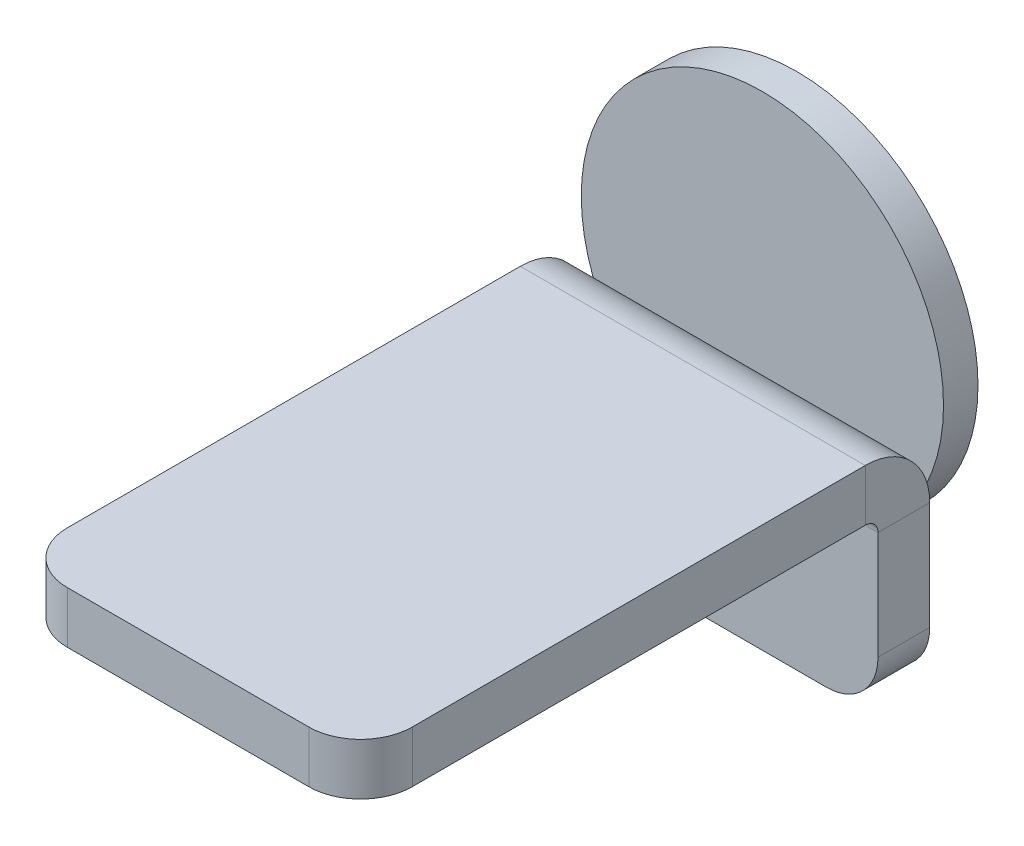
ISO-10303-21;
HEADER;
FILE_DESCRIPTION(('STEP AP214'),'2;1');
FILE_NAME('part.step','',(''),(''),'','','');
FILE_SCHEMA(('AUTOMOTIVE_DESIGN { 1 0 10303 214 1 1 1 1 }'));
ENDSEC;
DATA;
#1=APPLICATION_CONTEXT('core data for automotive mechanical design processes');
#2=APPLICATION_PROTOCOL_DEFINITION('international standard','automotive_design',2000,#1);
#3=PRODUCT_CONTEXT('',#1,'mechanical');
#4=PRODUCT('Part','Part','',(#3));
#5=PRODUCT_RELATED_PRODUCT_CATEGORY('part','',(#4));
#6=PRODUCT_DEFINITION_FORMATION('','',#4);
#7=PRODUCT_DEFINITION_CONTEXT('part definition',#1,'design');
#8=PRODUCT_DEFINITION('design','',#6,#7);
#9=PRODUCT_DEFINITION_SHAPE('','',#8);
#10=(LENGTH_UNIT() NAMED_UNIT(*) SI_UNIT(.MILLI.,.METRE.));
#11=(NAMED_UNIT(*) PLANE_ANGLE_UNIT() SI_UNIT($,.RADIAN.));
#12=(NAMED_UNIT(*) SI_UNIT($,.STERADIAN.) SOLID_ANGLE_UNIT());
#13=UNCERTAINTY_MEASURE_WITH_UNIT(LENGTH_MEASURE(1.E-05),#10,'distance_accuracy_value','');
#14=(GEOMETRIC_REPRESENTATION_CONTEXT(3) GLOBAL_UNCERTAINTY_ASSIGNED_CONTEXT((#13)) GLOBAL_UNIT_ASSIGNED_CONTEXT((#10,
#11,#12)) REPRESENTATION_CONTEXT('',''));
#15=CARTESIAN_POINT('',(0.,0.,0.));
#16=DIRECTION('',(0.,0.,1.));
#17=DIRECTION('',(1.,0.,0.));
#18=AXIS2_PLACEMENT_3D('',#15,#16,#17);
#19=CARTESIAN_POINT('',(-5.13676013367181,-6.68802634607003,-44.3808433248551));
#20=DIRECTION('',(0.,0.,-1.));
#21=DIRECTION('',(0.,1.,0.));
#22=AXIS2_PLACEMENT_3D('',#19,#20,#21);
#23=PLANE('',#22);
#24=DIRECTION('',(1.,0.,0.));
#25=VECTOR('',#24,1.);
#26=CARTESIAN_POINT('',(-15.4355127644494,-11.982621016454,-44.3808433248551));
#27=LINE('',#26,#25);
#28=CARTESIAN_POINT('',(3.93061364688567,-11.9826210164541,-44.3808433248551));
#29=VERTEX_POINT('',#28);
#30=CARTESIAN_POINT('',(-14.2041339142293,-11.982621016454,-44.3808433248551));
#31=VERTEX_POINT('',#30);
#32=EDGE_CURVE('E11',#29,#31,#27,.F.);
#33=ORIENTED_EDGE('',*,*,#32,.F.);
#34=CARTESIAN_POINT('',(-5.13676013367181,-6.68802634607003,-44.3808433248551));
#35=DIRECTION('',(0.,0.,-1.));
#36=DIRECTION('',(0.,1.,0.));
#37=AXIS2_PLACEMENT_3D('',#34,#35,#36);
#38=CIRCLE('',#37,10.5);
#39=EDGE_CURVE('E257',#31,#29,#38,.T.);
#40=ORIENTED_EDGE('',*,*,#39,.F.);
#41=EDGE_LOOP('',(#33,#40));
#42=FACE_BOUND('',#41,.T.);
#43=ADVANCED_FACE('F34',(#42),#23,.F.);
#44=CARTESIAN_POINT('',(-5.13676013367181,-6.68802634607003,-46.3808433248551));
#45=DIRECTION('',(0.,0.,-1.));
#46=DIRECTION('',(0.,1.,0.));
#47=AXIS2_PLACEMENT_3D('',#44,#45,#46);
#48=PLANE('',#47);
#49=CARTESIAN_POINT('',(-5.13676013367181,-6.68802634607003,-46.3808433248551));
#50=DIRECTION('',(0.,0.,-1.));
#51=DIRECTION('',(0.,1.,0.));
#52=AXIS2_PLACEMENT_3D('',#49,#50,#51);
#53=CIRCLE('',#52,10.5);
#54=CARTESIAN_POINT('',(-5.13676013367181,3.81197365392997,-46.3808433248551));
#55=VERTEX_POINT('',#54);
#56=EDGE_CURVE('E42',#55,#55,#53,.T.);
#57=ORIENTED_EDGE('',*,*,#56,.T.);
#58=EDGE_LOOP('',(#57));
#59=FACE_BOUND('',#58,.T.);
#60=CARTESIAN_POINT('',(-5.13676013367181,-6.68802634607003,-46.3808433248551));
#61=DIRECTION('',(0.,0.,-1.));
#62=DIRECTION('',(0.,1.,0.));
#63=AXIS2_PLACEMENT_3D('',#60,#61,#62);
#64=CIRCLE('',#63,4.);
#65=CARTESIAN_POINT('',(-5.13676013367181,-2.68802634607003,-46.3808433248551));
#66=VERTEX_POINT('',#65);
#67=EDGE_CURVE('E251',#66,#66,#64,.T.);
#68=ORIENTED_EDGE('',*,*,#67,.F.);
#69=EDGE_LOOP('',(#68));
#70=FACE_BOUND('',#69,.T.);
#71=ADVANCED_FACE('F298',(#59,#70),#48,.T.);
#72=CARTESIAN_POINT('',(-5.13676013367181,-6.68802634607003,-46.3808433248551));
#73=DIRECTION('',(0.,0.,1.));
#74=DIRECTION('',(0.,-1.,0.));
#75=AXIS2_PLACEMENT_3D('',#72,#73,#74);
#76=CYLINDRICAL_SURFACE('',#75,10.5);
#77=ORIENTED_EDGE('',*,*,#56,.F.);
#78=EDGE_LOOP('',(#77));
#79=FACE_BOUND('',#78,.T.);
#80=EDGE_CURVE('E52',#29,#31,#38,.T.);
#81=ORIENTED_EDGE('',*,*,#80,.T.);
#82=ORIENTED_EDGE('',*,*,#39,.T.);
#83=EDGE_LOOP('',(#81,#82));
#84=FACE_BOUND('',#83,.T.);
#85=ADVANCED_FACE('F36',(#79,#84),#76,.T.);
#86=CARTESIAN_POINT('',(-5.13676013367181,-6.68802634607003,-50.3808433248551));
#87=DIRECTION('',(0.,0.,1.));
#88=DIRECTION('',(0.,-1.,0.));
#89=AXIS2_PLACEMENT_3D('',#86,#87,#88);
#90=CYLINDRICAL_SURFACE('',#89,4.);
#91=CARTESIAN_POINT('',(-5.13676013367181,-6.68802634607003,-50.3808433248551));
#92=DIRECTION('',(0.,0.,-1.));
#93=DIRECTION('',(0.,1.,0.));
#94=AXIS2_PLACEMENT_3D('',#91,#92,#93);
#95=CIRCLE('',#94,4.);
#96=CARTESIAN_POINT('',(-5.13676013367181,-2.68802634607003,-50.3808433248551));
#97=VERTEX_POINT('',#96);
#98=EDGE_CURVE('E254',#97,#97,#95,.T.);
#99=ORIENTED_EDGE('',*,*,#98,.F.);
#100=EDGE_LOOP('',(#99));
#101=FACE_BOUND('',#100,.T.);
#102=ORIENTED_EDGE('',*,*,#67,.T.);
#103=EDGE_LOOP('',(#102));
#104=FACE_BOUND('',#103,.T.);
#105=ADVANCED_FACE('F305',(#101,#104),#90,.T.);
#106=CARTESIAN_POINT('',(-5.13676013367181,-6.68802634607003,-50.3808433248551));
#107=DIRECTION('',(0.,0.,-1.));
#108=DIRECTION('',(0.,1.,0.));
#109=AXIS2_PLACEMENT_3D('',#106,#107,#108);
#110=PLANE('',#109);
#111=CARTESIAN_POINT('',(-5.13676013367181,-6.68802634607003,-50.3808433248551));
#112=DIRECTION('',(0.,0.,-1.));
#113=DIRECTION('',(0.,1.,0.));
#114=AXIS2_PLACEMENT_3D('',#111,#112,#113);
#115=CIRCLE('',#114,3.);
#116=CARTESIAN_POINT('',(-5.13676013367181,-3.68802634607003,-50.3808433248551));
#117=VERTEX_POINT('',#116);
#118=EDGE_CURVE('E247',#117,#117,#115,.T.);
#119=ORIENTED_EDGE('',*,*,#118,.F.);
#120=EDGE_LOOP('',(#119));
#121=FACE_BOUND('',#120,.T.);
#122=ORIENTED_EDGE('',*,*,#98,.T.);
#123=EDGE_LOOP('',(#122));
#124=FACE_BOUND('',#123,.T.);
#125=ADVANCED_FACE('F308',(#121,#124),#110,.T.);
#126=CARTESIAN_POINT('',(-5.13676013367181,-6.68802634607003,-46.3808433248551));
#127=DIRECTION('',(0.,0.,-1.));
#128=DIRECTION('',(0.,1.,0.));
#129=AXIS2_PLACEMENT_3D('',#126,#127,#128);
#130=CYLINDRICAL_SURFACE('',#129,3.);
#131=CARTESIAN_POINT('',(-5.13676013367181,-6.68802634607003,-46.3808433248551));
#132=DIRECTION('',(0.,0.,-1.));
#133=DIRECTION('',(0.,1.,0.));
#134=AXIS2_PLACEMENT_3D('',#131,#132,#133);
#135=CIRCLE('',#134,3.);
#136=CARTESIAN_POINT('',(-5.13676013367181,-3.68802634607003,-46.3808433248551));
#137=VERTEX_POINT('',#136);
#138=EDGE_CURVE('E248',#137,#137,#135,.T.);
#139=ORIENTED_EDGE('',*,*,#138,.F.);
#140=EDGE_LOOP('',(#139));
#141=FACE_BOUND('',#140,.T.);
#142=ORIENTED_EDGE('',*,*,#118,.T.);
#143=EDGE_LOOP('',(#142));
#144=FACE_BOUND('',#143,.T.);
#145=ADVANCED_FACE('F312',(#141,#144),#130,.F.);
#146=CARTESIAN_POINT('',(-5.13676013367181,-6.68802634607003,-46.3808433248551));
#147=DIRECTION('',(0.,0.,-1.));
#148=DIRECTION('',(0.,1.,0.));
#149=AXIS2_PLACEMENT_3D('',#146,#147,#148);
#150=PLANE('',#149);
#151=ORIENTED_EDGE('',*,*,#138,.T.);
#152=EDGE_LOOP('',(#151));
#153=FACE_BOUND('',#152,.T.);
#154=ADVANCED_FACE('F315',(#153),#150,.T.);
#155=CARTESIAN_POINT('',(-15.4355127644494,-11.246021016454,-44.3808433248551));
#156=DIRECTION('',(0.,0.,1.));
#157=DIRECTION('',(-1.,0.,0.));
#158=AXIS2_PLACEMENT_3D('',#155,#156,#157);
#159=PLANE('',#158);
#160=DIRECTION('',(1.,0.,0.));
#161=VECTOR('',#160,1.);
#162=CARTESIAN_POINT('',(-15.4355127644494,-11.982621016454,-44.3808433248551));
#163=LINE('',#162,#161);
#164=CARTESIAN_POINT('',(-15.4355127644494,-11.982621016454,-44.3808433248551));
#165=VERTEX_POINT('',#164);
#166=EDGE_CURVE('E189',#165,#31,#163,.T.);
#167=ORIENTED_EDGE('',*,*,#166,.T.);
#168=ORIENTED_EDGE('',*,*,#80,.F.);
#169=CARTESIAN_POINT('',(4.5644872355506,-11.982621016454,-44.3808433248551));
#170=VERTEX_POINT('',#169);
#171=EDGE_CURVE('E175',#29,#170,#163,.T.);
#172=ORIENTED_EDGE('',*,*,#171,.T.);
#173=DIRECTION('',(0.,-1.,0.));
#174=VECTOR('',#173,1.);
#175=CARTESIAN_POINT('',(4.5644872355506,-11.246021016454,-44.3808433248551));
#176=LINE('',#175,#174);
#177=CARTESIAN_POINT('',(4.5644872355506,-18.246021016454,-44.3808433248551));
#178=VERTEX_POINT('',#177);
#179=EDGE_CURVE('E176',#170,#178,#176,.T.);
#180=ORIENTED_EDGE('',*,*,#179,.T.);
#181=CARTESIAN_POINT('',(1.5644872355506,-18.246021016454,-44.3808433248551));
#182=DIRECTION('',(0.,0.,1.));
#183=DIRECTION('',(-1.,0.,0.));
#184=AXIS2_PLACEMENT_3D('',#181,#182,#183);
#185=CIRCLE('',#184,3.);
#186=CARTESIAN_POINT('',(1.5644872355506,-21.2460210164541,-44.3808433248551));
#187=VERTEX_POINT('',#186);
#188=EDGE_CURVE('E217',#178,#187,#185,.F.);
#189=ORIENTED_EDGE('',*,*,#188,.T.);
#190=DIRECTION('',(1.,0.,0.));
#191=VECTOR('',#190,1.);
#192=CARTESIAN_POINT('',(-15.4355127644494,-21.2460210164541,-44.3808433248551));
#193=LINE('',#192,#191);
#194=CARTESIAN_POINT('',(-12.4355127644494,-21.2460210164541,-44.3808433248551));
#195=VERTEX_POINT('',#194);
#196=EDGE_CURVE('E203',#195,#187,#193,.T.);
#197=ORIENTED_EDGE('',*,*,#196,.F.);
#198=CARTESIAN_POINT('',(-12.4355127644494,-18.246021016454,-44.3808433248551));
#199=DIRECTION('',(0.,0.,1.));
#200=DIRECTION('',(-1.,0.,0.));
#201=AXIS2_PLACEMENT_3D('',#198,#199,#200);
#202=CIRCLE('',#201,3.);
#203=CARTESIAN_POINT('',(-15.4355127644494,-18.246021016454,-44.3808433248551));
#204=VERTEX_POINT('',#203);
#205=EDGE_CURVE('E215',#195,#204,#202,.F.);
#206=ORIENTED_EDGE('',*,*,#205,.T.);
#207=DIRECTION('',(0.,-1.,0.));
#208=VECTOR('',#207,1.);
#209=CARTESIAN_POINT('',(-15.4355127644494,-11.246021016454,-44.3808433248551));
#210=LINE('',#209,#208);
#211=EDGE_CURVE('E162',#165,#204,#210,.T.);
#212=ORIENTED_EDGE('',*,*,#211,.F.);
#213=EDGE_LOOP('',(#167,#168,#172,#180,#189,#197,#206,#212));
#214=FACE_BOUND('',#213,.T.);
#215=ADVANCED_FACE('F263',(#214),#159,.F.);
#216=CARTESIAN_POINT('',(-15.4355127644494,-11.982621016454,-41.380843324855));
#217=DIRECTION('',(-1.,0.,0.));
#218=DIRECTION('',(0.,0.,-1.));
#219=AXIS2_PLACEMENT_3D('',#216,#217,#218);
#220=PLANE('',#219);
#221=DIRECTION('',(0.,0.,-1.));
#222=VECTOR('',#221,1.);
#223=CARTESIAN_POINT('',(-15.4355127644494,-11.982621016454,-41.380843324855));
#224=LINE('',#223,#222);
#225=CARTESIAN_POINT('',(-15.4355127644494,-11.982621016454,-41.380843324855));
#226=VERTEX_POINT('',#225);
#227=EDGE_CURVE('E127',#226,#165,#224,.T.);
#228=ORIENTED_EDGE('',*,*,#227,.F.);
#229=CARTESIAN_POINT('',(-15.4355127644494,-11.982621016454,-40.644243324855));
#230=DIRECTION('',(1.,0.,0.));
#231=DIRECTION('',(0.,0.,1.));
#232=AXIS2_PLACEMENT_3D('',#229,#230,#231);
#233=CIRCLE('',#232,0.7366);
#234=CARTESIAN_POINT('',(-15.4355127644494,-11.246021016454,-40.644243324855));
#235=VERTEX_POINT('',#234);
#236=EDGE_CURVE('E132',#235,#226,#233,.F.);
#237=ORIENTED_EDGE('',*,*,#236,.F.);
#238=DIRECTION('',(0.,-1.,0.));
#239=VECTOR('',#238,1.);
#240=CARTESIAN_POINT('',(-15.4355127644494,-8.24602101645405,-40.644243324855));
#241=LINE('',#240,#239);
#242=CARTESIAN_POINT('',(-15.4355127644494,-8.24602101645405,-40.644243324855));
#243=VERTEX_POINT('',#242);
#244=EDGE_CURVE('E140',#243,#235,#241,.T.);
#245=ORIENTED_EDGE('',*,*,#244,.F.);
#246=CARTESIAN_POINT('',(-15.4355127644494,-11.982621016454,-40.644243324855));
#247=DIRECTION('',(-1.,0.,0.));
#248=DIRECTION('',(0.,0.,-1.));
#249=AXIS2_PLACEMENT_3D('',#246,#247,#248);
#250=CIRCLE('',#249,3.7366);
#251=EDGE_CURVE('E134',#243,#165,#250,.T.);
#252=ORIENTED_EDGE('',*,*,#251,.T.);
#253=EDGE_LOOP('',(#228,#237,#245,#252));
#254=FACE_BOUND('',#253,.T.);
#255=ADVANCED_FACE('F129',(#254),#220,.T.);
#256=CARTESIAN_POINT('',(-15.4355127644494,-8.24602101645405,-40.644243324855));
#257=DIRECTION('',(-1.,0.,0.));
#258=DIRECTION('',(0.,0.,-1.));
#259=AXIS2_PLACEMENT_3D('',#256,#257,#258);
#260=PLANE('',#259);
#261=ORIENTED_EDGE('',*,*,#211,.T.);
#262=DIRECTION('',(0.,0.,-1.));
#263=VECTOR('',#262,1.);
#264=CARTESIAN_POINT('',(-15.4355127644494,-18.246021016454,-40.644243324855));
#265=LINE('',#264,#263);
#266=CARTESIAN_POINT('',(-15.4355127644494,-18.246021016454,-41.380843324855));
#267=VERTEX_POINT('',#266);
#268=EDGE_CURVE('E161',#204,#267,#265,.F.);
#269=ORIENTED_EDGE('',*,*,#268,.T.);
#270=DIRECTION('',(0.,-1.,0.));
#271=VECTOR('',#270,1.);
#272=CARTESIAN_POINT('',(-15.4355127644494,-11.246021016454,-41.380843324855));
#273=LINE('',#272,#271);
#274=EDGE_CURVE('E149',#226,#267,#273,.T.);
#275=ORIENTED_EDGE('',*,*,#274,.F.);
#276=ORIENTED_EDGE('',*,*,#227,.T.);
#277=EDGE_LOOP('',(#261,#269,#275,#276));
#278=FACE_BOUND('',#277,.T.);
#279=ADVANCED_FACE('F159',(#278),#260,.T.);
#280=CARTESIAN_POINT('',(4.5644872355506,-11.246021016454,-40.644243324855));
#281=DIRECTION('',(1.,0.,0.));
#282=DIRECTION('',(0.,0.,1.));
#283=AXIS2_PLACEMENT_3D('',#280,#281,#282);
#284=PLANE('',#283);
#285=DIRECTION('',(0.,1.,0.));
#286=VECTOR('',#285,1.);
#287=CARTESIAN_POINT('',(4.5644872355506,-11.246021016454,-40.644243324855));
#288=LINE('',#287,#286);
#289=CARTESIAN_POINT('',(4.5644872355506,-11.246021016454,-40.644243324855));
#290=VERTEX_POINT('',#289);
#291=CARTESIAN_POINT('',(4.5644872355506,-8.24602101645405,-40.644243324855));
#292=VERTEX_POINT('',#291);
#293=EDGE_CURVE('E208',#290,#292,#288,.T.);
#294=ORIENTED_EDGE('',*,*,#293,.F.);
#295=CARTESIAN_POINT('',(4.5644872355506,-11.982621016454,-40.644243324855));
#296=DIRECTION('',(1.,0.,0.));
#297=DIRECTION('',(0.,0.,1.));
#298=AXIS2_PLACEMENT_3D('',#295,#296,#297);
#299=CIRCLE('',#298,0.7366);
#300=CARTESIAN_POINT('',(4.5644872355506,-11.982621016454,-41.380843324855));
#301=VERTEX_POINT('',#300);
#302=EDGE_CURVE('E180',#290,#301,#299,.F.);
#303=ORIENTED_EDGE('',*,*,#302,.T.);
#304=DIRECTION('',(0.,0.,1.));
#305=VECTOR('',#304,1.);
#306=CARTESIAN_POINT('',(4.5644872355506,-11.982621016454,-44.3808433248551));
#307=LINE('',#306,#305);
#308=EDGE_CURVE('E206',#170,#301,#307,.T.);
#309=ORIENTED_EDGE('',*,*,#308,.F.);
#310=CARTESIAN_POINT('',(4.5644872355506,-11.982621016454,-40.644243324855));
#311=DIRECTION('',(-1.,0.,0.));
#312=DIRECTION('',(0.,0.,-1.));
#313=AXIS2_PLACEMENT_3D('',#310,#311,#312);
#314=CIRCLE('',#313,3.7366);
#315=EDGE_CURVE('E186',#292,#170,#314,.T.);
#316=ORIENTED_EDGE('',*,*,#315,.F.);
#317=EDGE_LOOP('',(#294,#303,#309,#316));
#318=FACE_BOUND('',#317,.T.);
#319=ADVANCED_FACE('F341',(#318),#284,.T.);
#320=CARTESIAN_POINT('',(4.5644872355506,-11.982621016454,-44.3808433248551));
#321=DIRECTION('',(1.,0.,0.));
#322=DIRECTION('',(0.,0.,1.));
#323=AXIS2_PLACEMENT_3D('',#320,#321,#322);
#324=PLANE('',#323);
#325=DIRECTION('',(0.,0.,-1.));
#326=VECTOR('',#325,1.);
#327=CARTESIAN_POINT('',(4.5644872355506,-8.24602101645405,-11.380843324855));
#328=LINE('',#327,#326);
#329=CARTESIAN_POINT('',(4.5644872355506,-8.24602101645405,-14.380843324855));
#330=VERTEX_POINT('',#329);
#331=EDGE_CURVE('E184',#330,#292,#328,.T.);
#332=ORIENTED_EDGE('',*,*,#331,.F.);
#333=DIRECTION('',(0.,-1.,0.));
#334=VECTOR('',#333,1.);
#335=CARTESIAN_POINT('',(4.5644872355506,-11.982621016454,-14.380843324855));
#336=LINE('',#335,#334);
#337=CARTESIAN_POINT('',(4.5644872355506,-11.246021016454,-14.380843324855));
#338=VERTEX_POINT('',#337);
#339=EDGE_CURVE('E228',#330,#338,#336,.T.);
#340=ORIENTED_EDGE('',*,*,#339,.T.);
#341=DIRECTION('',(0.,0.,-1.));
#342=VECTOR('',#341,1.);
#343=CARTESIAN_POINT('',(4.5644872355506,-11.246021016454,-11.380843324855));
#344=LINE('',#343,#342);
#345=EDGE_CURVE('E182',#338,#290,#344,.T.);
#346=ORIENTED_EDGE('',*,*,#345,.T.);
#347=ORIENTED_EDGE('',*,*,#293,.T.);
#348=EDGE_LOOP('',(#332,#340,#346,#347));
#349=FACE_BOUND('',#348,.T.);
#350=ADVANCED_FACE('F338',(#349),#324,.T.);
#351=CARTESIAN_POINT('',(-15.4355127644494,-21.2460210164541,-41.380843324855));
#352=DIRECTION('',(0.,-1.,0.));
#353=DIRECTION('',(0.,0.,1.));
#354=AXIS2_PLACEMENT_3D('',#351,#352,#353);
#355=PLANE('',#354);
#356=ORIENTED_EDGE('',*,*,#196,.T.);
#357=DIRECTION('',(0.,0.,-1.));
#358=VECTOR('',#357,1.);
#359=CARTESIAN_POINT('',(1.5644872355506,-21.2460210164541,-41.380843324855));
#360=LINE('',#359,#358);
#361=CARTESIAN_POINT('',(1.5644872355506,-21.2460210164541,-41.380843324855));
#362=VERTEX_POINT('',#361);
#363=EDGE_CURVE('E222',#187,#362,#360,.F.);
#364=ORIENTED_EDGE('',*,*,#363,.T.);
#365=DIRECTION('',(1.,0.,0.));
#366=VECTOR('',#365,1.);
#367=CARTESIAN_POINT('',(-15.4355127644494,-21.2460210164541,-41.380843324855));
#368=LINE('',#367,#366);
#369=CARTESIAN_POINT('',(-12.4355127644494,-21.2460210164541,-41.380843324855));
#370=VERTEX_POINT('',#369);
#371=EDGE_CURVE('E156',#370,#362,#368,.T.);
#372=ORIENTED_EDGE('',*,*,#371,.F.);
#373=DIRECTION('',(0.,0.,-1.));
#374=VECTOR('',#373,1.);
#375=CARTESIAN_POINT('',(-12.4355127644494,-21.2460210164541,-41.380843324855));
#376=LINE('',#375,#374);
#377=EDGE_CURVE('E219',#370,#195,#376,.T.);
#378=ORIENTED_EDGE('',*,*,#377,.T.);
#379=EDGE_LOOP('',(#356,#364,#372,#378));
#380=FACE_BOUND('',#379,.T.);
#381=ADVANCED_FACE('F280',(#380),#355,.T.);
#382=CARTESIAN_POINT('',(-15.4355127644494,-11.246021016454,-41.380843324855));
#383=DIRECTION('',(0.,0.,1.));
#384=DIRECTION('',(-1.,0.,0.));
#385=AXIS2_PLACEMENT_3D('',#382,#383,#384);
#386=PLANE('',#385);
#387=ORIENTED_EDGE('',*,*,#371,.T.);
#388=CARTESIAN_POINT('',(1.5644872355506,-18.246021016454,-41.380843324855));
#389=DIRECTION('',(0.,0.,1.));
#390=DIRECTION('',(-1.,0.,0.));
#391=AXIS2_PLACEMENT_3D('',#388,#389,#390);
#392=CIRCLE('',#391,3.);
#393=CARTESIAN_POINT('',(4.5644872355506,-18.246021016454,-41.380843324855));
#394=VERTEX_POINT('',#393);
#395=EDGE_CURVE('E226',#362,#394,#392,.T.);
#396=ORIENTED_EDGE('',*,*,#395,.T.);
#397=DIRECTION('',(0.,-1.,0.));
#398=VECTOR('',#397,1.);
#399=CARTESIAN_POINT('',(4.5644872355506,-11.246021016454,-41.380843324855));
#400=LINE('',#399,#398);
#401=EDGE_CURVE('E152',#301,#394,#400,.T.);
#402=ORIENTED_EDGE('',*,*,#401,.F.);
#403=DIRECTION('',(1.,0.,0.));
#404=VECTOR('',#403,1.);
#405=CARTESIAN_POINT('',(-15.4355127644494,-11.982621016454,-41.380843324855));
#406=LINE('',#405,#404);
#407=EDGE_CURVE('E146',#226,#301,#406,.T.);
#408=ORIENTED_EDGE('',*,*,#407,.F.);
#409=ORIENTED_EDGE('',*,*,#274,.T.);
#410=CARTESIAN_POINT('',(-12.4355127644494,-18.246021016454,-41.380843324855));
#411=DIRECTION('',(0.,0.,1.));
#412=DIRECTION('',(-1.,0.,0.));
#413=AXIS2_PLACEMENT_3D('',#410,#411,#412);
#414=CIRCLE('',#413,3.);
#415=EDGE_CURVE('E224',#267,#370,#414,.T.);
#416=ORIENTED_EDGE('',*,*,#415,.T.);
#417=EDGE_LOOP('',(#387,#396,#402,#408,#409,#416));
#418=FACE_BOUND('',#417,.T.);
#419=ADVANCED_FACE('F148',(#418),#386,.T.);
#420=CARTESIAN_POINT('',(-15.4355127644494,-11.982621016454,-40.644243324855));
#421=DIRECTION('',(1.,0.,0.));
#422=DIRECTION('',(0.,0.,1.));
#423=AXIS2_PLACEMENT_3D('',#420,#421,#422);
#424=CYLINDRICAL_SURFACE('',#423,0.7366);
#425=ORIENTED_EDGE('',*,*,#302,.F.);
#426=DIRECTION('',(1.,0.,0.));
#427=VECTOR('',#426,1.);
#428=CARTESIAN_POINT('',(-15.4355127644494,-11.246021016454,-40.644243324855));
#429=LINE('',#428,#427);
#430=EDGE_CURVE('E157',#235,#290,#429,.T.);
#431=ORIENTED_EDGE('',*,*,#430,.F.);
#432=ORIENTED_EDGE('',*,*,#236,.T.);
#433=ORIENTED_EDGE('',*,*,#407,.T.);
#434=EDGE_LOOP('',(#425,#431,#432,#433));
#435=FACE_BOUND('',#434,.T.);
#436=ADVANCED_FACE('F165',(#435),#424,.F.);
#437=CARTESIAN_POINT('',(-15.4355127644494,-11.246021016454,-11.380843324855));
#438=DIRECTION('',(0.,-1.,0.));
#439=DIRECTION('',(0.,0.,1.));
#440=AXIS2_PLACEMENT_3D('',#437,#438,#439);
#441=PLANE('',#440);
#442=ORIENTED_EDGE('',*,*,#345,.F.);
#443=CARTESIAN_POINT('',(1.5644872355506,-11.246021016454,-14.380843324855));
#444=DIRECTION('',(0.,-1.,0.));
#445=DIRECTION('',(0.,0.,1.));
#446=AXIS2_PLACEMENT_3D('',#443,#444,#445);
#447=CIRCLE('',#446,3.);
#448=CARTESIAN_POINT('',(1.5644872355506,-11.246021016454,-11.380843324855));
#449=VERTEX_POINT('',#448);
#450=EDGE_CURVE('E233',#338,#449,#447,.T.);
#451=ORIENTED_EDGE('',*,*,#450,.T.);
#452=DIRECTION('',(1.,0.,0.));
#453=VECTOR('',#452,1.);
#454=CARTESIAN_POINT('',(-15.4355127644494,-11.246021016454,-11.380843324855));
#455=LINE('',#454,#453);
#456=CARTESIAN_POINT('',(-12.4355127644494,-11.246021016454,-11.380843324855));
#457=VERTEX_POINT('',#456);
#458=EDGE_CURVE('E198',#457,#449,#455,.T.);
#459=ORIENTED_EDGE('',*,*,#458,.F.);
#460=CARTESIAN_POINT('',(-12.4355127644494,-11.246021016454,-14.380843324855));
#461=DIRECTION('',(0.,-1.,0.));
#462=DIRECTION('',(0.,0.,1.));
#463=AXIS2_PLACEMENT_3D('',#460,#461,#462);
#464=CIRCLE('',#463,3.);
#465=CARTESIAN_POINT('',(-15.4355127644494,-11.246021016454,-14.380843324855));
#466=VERTEX_POINT('',#465);
#467=EDGE_CURVE('E231',#457,#466,#464,.T.);
#468=ORIENTED_EDGE('',*,*,#467,.T.);
#469=DIRECTION('',(0.,0.,-1.));
#470=VECTOR('',#469,1.);
#471=CARTESIAN_POINT('',(-15.4355127644494,-11.246021016454,-11.380843324855));
#472=LINE('',#471,#470);
#473=EDGE_CURVE('E167',#466,#235,#472,.T.);
#474=ORIENTED_EDGE('',*,*,#473,.T.);
#475=ORIENTED_EDGE('',*,*,#430,.T.);
#476=EDGE_LOOP('',(#442,#451,#459,#468,#474,#475));
#477=FACE_BOUND('',#476,.T.);
#478=ADVANCED_FACE('F362',(#477),#441,.T.);
#479=CARTESIAN_POINT('',(-15.4355127644494,-8.24602101645405,-11.380843324855));
#480=DIRECTION('',(0.,0.,1.));
#481=DIRECTION('',(-1.,0.,0.));
#482=AXIS2_PLACEMENT_3D('',#479,#480,#481);
#483=PLANE('',#482);
#484=ORIENTED_EDGE('',*,*,#458,.T.);
#485=DIRECTION('',(0.,-1.,0.));
#486=VECTOR('',#485,1.);
#487=CARTESIAN_POINT('',(1.5644872355506,-8.24602101645405,-11.380843324855));
#488=LINE('',#487,#486);
#489=CARTESIAN_POINT('',(1.5644872355506,-8.24602101645405,-11.380843324855));
#490=VERTEX_POINT('',#489);
#491=EDGE_CURVE('E238',#449,#490,#488,.F.);
#492=ORIENTED_EDGE('',*,*,#491,.T.);
#493=DIRECTION('',(1.,0.,0.));
#494=VECTOR('',#493,1.);
#495=CARTESIAN_POINT('',(-15.4355127644494,-8.24602101645405,-11.380843324855));
#496=LINE('',#495,#494);
#497=CARTESIAN_POINT('',(-12.4355127644494,-8.24602101645405,-11.380843324855));
#498=VERTEX_POINT('',#497);
#499=EDGE_CURVE('E195',#498,#490,#496,.T.);
#500=ORIENTED_EDGE('',*,*,#499,.F.);
#501=DIRECTION('',(0.,-1.,0.));
#502=VECTOR('',#501,1.);
#503=CARTESIAN_POINT('',(-12.4355127644494,-11.246021016454,-11.380843324855));
#504=LINE('',#503,#502);
#505=EDGE_CURVE('E235',#498,#457,#504,.T.);
#506=ORIENTED_EDGE('',*,*,#505,.T.);
#507=EDGE_LOOP('',(#484,#492,#500,#506));
#508=FACE_BOUND('',#507,.T.);
#509=ADVANCED_FACE('F372',(#508),#483,.T.);
#510=CARTESIAN_POINT('',(-15.4355127644494,-8.24602101645405,-11.380843324855));
#511=DIRECTION('',(0.,-1.,0.));
#512=DIRECTION('',(0.,0.,1.));
#513=AXIS2_PLACEMENT_3D('',#510,#511,#512);
#514=PLANE('',#513);
#515=ORIENTED_EDGE('',*,*,#499,.T.);
#516=CARTESIAN_POINT('',(1.5644872355506,-8.24602101645405,-14.380843324855));
#517=DIRECTION('',(0.,-1.,0.));
#518=DIRECTION('',(0.,0.,1.));
#519=AXIS2_PLACEMENT_3D('',#516,#517,#518);
#520=CIRCLE('',#519,3.);
#521=EDGE_CURVE('E242',#490,#330,#520,.F.);
#522=ORIENTED_EDGE('',*,*,#521,.T.);
#523=ORIENTED_EDGE('',*,*,#331,.T.);
#524=DIRECTION('',(1.,0.,0.));
#525=VECTOR('',#524,1.);
#526=CARTESIAN_POINT('',(-15.4355127644494,-8.24602101645405,-40.644243324855));
#527=LINE('',#526,#525);
#528=EDGE_CURVE('E192',#243,#292,#527,.T.);
#529=ORIENTED_EDGE('',*,*,#528,.F.);
#530=DIRECTION('',(0.,0.,-1.));
#531=VECTOR('',#530,1.);
#532=CARTESIAN_POINT('',(-15.4355127644494,-8.24602101645405,-11.380843324855));
#533=LINE('',#532,#531);
#534=CARTESIAN_POINT('',(-15.4355127644494,-8.24602101645405,-14.380843324855));
#535=VERTEX_POINT('',#534);
#536=EDGE_CURVE('E169',#535,#243,#533,.T.);
#537=ORIENTED_EDGE('',*,*,#536,.F.);
#538=CARTESIAN_POINT('',(-12.4355127644494,-8.24602101645405,-14.380843324855));
#539=DIRECTION('',(0.,-1.,0.));
#540=DIRECTION('',(0.,0.,1.));
#541=AXIS2_PLACEMENT_3D('',#538,#539,#540);
#542=CIRCLE('',#541,3.);
#543=EDGE_CURVE('E240',#535,#498,#542,.F.);
#544=ORIENTED_EDGE('',*,*,#543,.T.);
#545=EDGE_LOOP('',(#515,#522,#523,#529,#537,#544));
#546=FACE_BOUND('',#545,.T.);
#547=ADVANCED_FACE('F358',(#546),#514,.F.);
#548=CARTESIAN_POINT('',(-15.4355127644494,-11.982621016454,-40.644243324855));
#549=DIRECTION('',(1.,0.,0.));
#550=DIRECTION('',(0.,0.,1.));
#551=AXIS2_PLACEMENT_3D('',#548,#549,#550);
#552=CYLINDRICAL_SURFACE('',#551,3.7366);
#553=ORIENTED_EDGE('',*,*,#315,.T.);
#554=ORIENTED_EDGE('',*,*,#171,.F.);
#555=ORIENTED_EDGE('',*,*,#32,.T.);
#556=ORIENTED_EDGE('',*,*,#166,.F.);
#557=ORIENTED_EDGE('',*,*,#251,.F.);
#558=ORIENTED_EDGE('',*,*,#528,.T.);
#559=EDGE_LOOP('',(#553,#554,#555,#556,#557,#558));
#560=FACE_BOUND('',#559,.T.);
#561=ADVANCED_FACE('F267',(#560),#552,.T.);
#562=CARTESIAN_POINT('',(-15.4355127644494,-11.982621016454,-40.644243324855));
#563=DIRECTION('',(1.,0.,0.));
#564=DIRECTION('',(0.,0.,1.));
#565=AXIS2_PLACEMENT_3D('',#562,#563,#564);
#566=PLANE('',#565);
#567=ORIENTED_EDGE('',*,*,#473,.F.);
#568=DIRECTION('',(0.,-1.,0.));
#569=VECTOR('',#568,1.);
#570=CARTESIAN_POINT('',(-15.4355127644494,-8.24602101645405,-14.380843324855));
#571=LINE('',#570,#569);
#572=EDGE_CURVE('E244',#466,#535,#571,.F.);
#573=ORIENTED_EDGE('',*,*,#572,.T.);
#574=ORIENTED_EDGE('',*,*,#536,.T.);
#575=ORIENTED_EDGE('',*,*,#244,.T.);
#576=EDGE_LOOP('',(#567,#573,#574,#575));
#577=FACE_BOUND('',#576,.T.);
#578=ADVANCED_FACE('F367',(#577),#566,.F.);
#579=CARTESIAN_POINT('',(4.5644872355506,-11.982621016454,-40.644243324855));
#580=DIRECTION('',(1.,0.,0.));
#581=DIRECTION('',(0.,0.,1.));
#582=AXIS2_PLACEMENT_3D('',#579,#580,#581);
#583=PLANE('',#582);
#584=ORIENTED_EDGE('',*,*,#401,.T.);
#585=DIRECTION('',(0.,0.,-1.));
#586=VECTOR('',#585,1.);
#587=CARTESIAN_POINT('',(4.5644872355506,-18.246021016454,-40.644243324855));
#588=LINE('',#587,#586);
#589=EDGE_CURVE('E139',#394,#178,#588,.T.);
#590=ORIENTED_EDGE('',*,*,#589,.T.);
#591=ORIENTED_EDGE('',*,*,#179,.F.);
#592=ORIENTED_EDGE('',*,*,#308,.T.);
#593=EDGE_LOOP('',(#584,#590,#591,#592));
#594=FACE_BOUND('',#593,.T.);
#595=ADVANCED_FACE('F274',(#594),#583,.T.);
#596=CARTESIAN_POINT('',(1.5644872355506,-18.246021016454,-40.644243324855));
#597=DIRECTION('',(0.,0.,-1.));
#598=DIRECTION('',(1.,0.,0.));
#599=AXIS2_PLACEMENT_3D('',#596,#597,#598);
#600=CYLINDRICAL_SURFACE('',#599,3.);
#601=ORIENTED_EDGE('',*,*,#395,.F.);
#602=ORIENTED_EDGE('',*,*,#363,.F.);
#603=ORIENTED_EDGE('',*,*,#188,.F.);
#604=ORIENTED_EDGE('',*,*,#589,.F.);
#605=EDGE_LOOP('',(#601,#602,#603,#604));
#606=FACE_BOUND('',#605,.T.);
#607=ADVANCED_FACE('F284',(#606),#600,.T.);
#608=CARTESIAN_POINT('',(1.5644872355506,-11.982621016454,-14.380843324855));
#609=DIRECTION('',(0.,-1.,0.));
#610=DIRECTION('',(0.,0.,1.));
#611=AXIS2_PLACEMENT_3D('',#608,#609,#610);
#612=CYLINDRICAL_SURFACE('',#611,3.);
#613=ORIENTED_EDGE('',*,*,#521,.F.);
#614=ORIENTED_EDGE('',*,*,#491,.F.);
#615=ORIENTED_EDGE('',*,*,#450,.F.);
#616=ORIENTED_EDGE('',*,*,#339,.F.);
#617=EDGE_LOOP('',(#613,#614,#615,#616));
#618=FACE_BOUND('',#617,.T.);
#619=ADVANCED_FACE('F293',(#618),#612,.T.);
#620=CARTESIAN_POINT('',(-12.4355127644494,-8.24602101645405,-14.380843324855));
#621=DIRECTION('',(0.,1.,0.));
#622=DIRECTION('',(0.,0.,-1.));
#623=AXIS2_PLACEMENT_3D('',#620,#621,#622);
#624=CYLINDRICAL_SURFACE('',#623,3.);
#625=ORIENTED_EDGE('',*,*,#543,.F.);
#626=ORIENTED_EDGE('',*,*,#572,.F.);
#627=ORIENTED_EDGE('',*,*,#467,.F.);
#628=ORIENTED_EDGE('',*,*,#505,.F.);
#629=EDGE_LOOP('',(#625,#626,#627,#628));
#630=FACE_BOUND('',#629,.T.);
#631=ADVANCED_FACE('F288',(#630),#624,.T.);
#632=CARTESIAN_POINT('',(-12.4355127644494,-18.246021016454,-41.380843324855));
#633=DIRECTION('',(0.,0.,-1.));
#634=DIRECTION('',(1.,0.,0.));
#635=AXIS2_PLACEMENT_3D('',#632,#633,#634);
#636=CYLINDRICAL_SURFACE('',#635,3.);
#637=ORIENTED_EDGE('',*,*,#415,.F.);
#638=ORIENTED_EDGE('',*,*,#268,.F.);
#639=ORIENTED_EDGE('',*,*,#205,.F.);
#640=ORIENTED_EDGE('',*,*,#377,.F.);
#641=EDGE_LOOP('',(#637,#638,#639,#640));
#642=FACE_BOUND('',#641,.T.);
#643=ADVANCED_FACE('F286',(#642),#636,.T.);
#644=CLOSED_SHELL('',(#43,#71,#85,#105,#125,#145,#154,#215,#255,#279,#319,#350,#381,#419,#436,
#478,#509,#547,#561,#578,#595,#607,#619,#631,#643));
#645=MANIFOLD_SOLID_BREP('B2',#644);
#646=ADVANCED_BREP_SHAPE_REPRESENTATION('',(#18,#645),#14);
#647=SHAPE_DEFINITION_REPRESENTATION(#9,#646);
ENDSEC;
END-ISO-10303-21;
